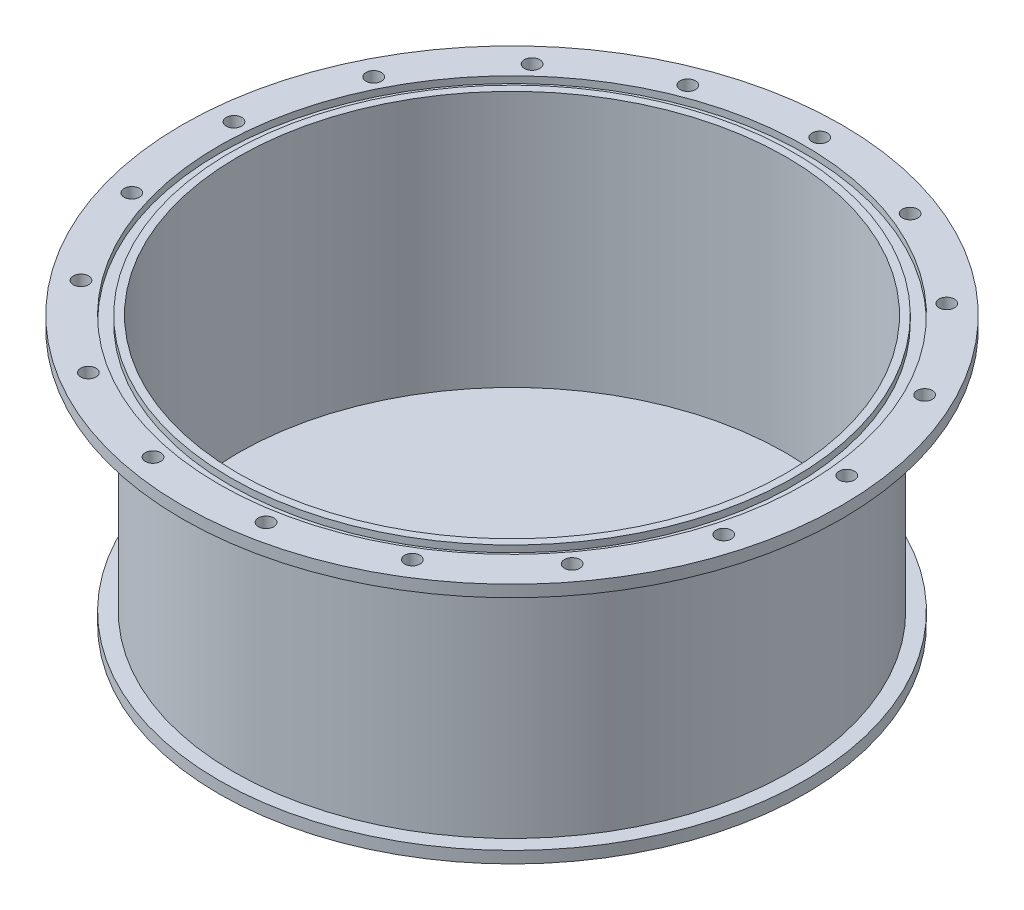
ISO-10303-21;
HEADER;
FILE_DESCRIPTION(('STEP AP214'),'2;1');
FILE_NAME('part.step','',(''),(''),'','','');
FILE_SCHEMA(('AUTOMOTIVE_DESIGN { 1 0 10303 214 1 1 1 1 }'));
ENDSEC;
DATA;
#1=APPLICATION_CONTEXT('core data for automotive mechanical design processes');
#2=APPLICATION_PROTOCOL_DEFINITION('international standard','automotive_design',2000,#1);
#3=PRODUCT_CONTEXT('',#1,'mechanical');
#4=PRODUCT('Part','Part','',(#3));
#5=PRODUCT_RELATED_PRODUCT_CATEGORY('part','',(#4));
#6=PRODUCT_DEFINITION_FORMATION('','',#4);
#7=PRODUCT_DEFINITION_CONTEXT('part definition',#1,'design');
#8=PRODUCT_DEFINITION('design','',#6,#7);
#9=PRODUCT_DEFINITION_SHAPE('','',#8);
#10=(LENGTH_UNIT() NAMED_UNIT(*) SI_UNIT(.MILLI.,.METRE.));
#11=(NAMED_UNIT(*) PLANE_ANGLE_UNIT() SI_UNIT($,.RADIAN.));
#12=(NAMED_UNIT(*) SI_UNIT($,.STERADIAN.) SOLID_ANGLE_UNIT());
#13=UNCERTAINTY_MEASURE_WITH_UNIT(LENGTH_MEASURE(1.E-05),#10,'distance_accuracy_value','');
#14=(GEOMETRIC_REPRESENTATION_CONTEXT(3) GLOBAL_UNCERTAINTY_ASSIGNED_CONTEXT((#13)) GLOBAL_UNIT_ASSIGNED_CONTEXT((#10,
#11,#12)) REPRESENTATION_CONTEXT('',''));
#15=CARTESIAN_POINT('',(0.,0.,0.));
#16=DIRECTION('',(0.,0.,1.));
#17=DIRECTION('',(1.,0.,0.));
#18=AXIS2_PLACEMENT_3D('',#15,#16,#17);
#19=CARTESIAN_POINT('',(0.,175.,0.));
#20=DIRECTION('',(0.,-1.,0.));
#21=DIRECTION('',(0.,0.,-1.));
#22=AXIS2_PLACEMENT_3D('',#19,#20,#21);
#23=CYLINDRICAL_SURFACE('',#22,190.);
#24=CARTESIAN_POINT('',(0.,0.,0.));
#25=DIRECTION('',(0.,1.,0.));
#26=DIRECTION('',(0.,0.,1.));
#27=AXIS2_PLACEMENT_3D('',#24,#25,#26);
#28=CIRCLE('',#27,190.);
#29=CARTESIAN_POINT('',(0.,0.,190.));
#30=VERTEX_POINT('',#29);
#31=EDGE_CURVE('E42',#30,#30,#28,.T.);
#32=ORIENTED_EDGE('',*,*,#31,.T.);
#33=EDGE_LOOP('',(#32));
#34=FACE_BOUND('',#33,.T.);
#35=CARTESIAN_POINT('',(0.,167.,0.));
#36=DIRECTION('',(0.,1.,0.));
#37=DIRECTION('',(0.,0.,1.));
#38=AXIS2_PLACEMENT_3D('',#35,#36,#37);
#39=CIRCLE('',#38,190.);
#40=CARTESIAN_POINT('',(0.,167.,190.));
#41=VERTEX_POINT('',#40);
#42=EDGE_CURVE('E10',#41,#41,#39,.T.);
#43=ORIENTED_EDGE('',*,*,#42,.F.);
#44=EDGE_LOOP('',(#43));
#45=FACE_BOUND('',#44,.T.);
#46=ADVANCED_FACE('F40',(#34,#45),#23,.T.);
#47=CARTESIAN_POINT('',(0.,-8.,0.));
#48=DIRECTION('',(0.,1.,0.));
#49=DIRECTION('',(0.,0.,1.));
#50=AXIS2_PLACEMENT_3D('',#47,#48,#49);
#51=CYLINDRICAL_SURFACE('',#50,200.);
#52=CARTESIAN_POINT('',(0.,-8.,0.));
#53=DIRECTION('',(0.,1.,0.));
#54=DIRECTION('',(0.,0.,1.));
#55=AXIS2_PLACEMENT_3D('',#52,#53,#54);
#56=CIRCLE('',#55,200.);
#57=CARTESIAN_POINT('',(0.,-8.,200.));
#58=VERTEX_POINT('',#57);
#59=EDGE_CURVE('E48',#58,#58,#56,.T.);
#60=ORIENTED_EDGE('',*,*,#59,.T.);
#61=EDGE_LOOP('',(#60));
#62=FACE_BOUND('',#61,.T.);
#63=CARTESIAN_POINT('',(0.,0.,0.));
#64=DIRECTION('',(0.,1.,0.));
#65=DIRECTION('',(0.,0.,1.));
#66=AXIS2_PLACEMENT_3D('',#63,#64,#65);
#67=CIRCLE('',#66,200.);
#68=CARTESIAN_POINT('',(0.,0.,200.));
#69=VERTEX_POINT('',#68);
#70=EDGE_CURVE('E52',#69,#69,#67,.T.);
#71=ORIENTED_EDGE('',*,*,#70,.F.);
#72=EDGE_LOOP('',(#71));
#73=FACE_BOUND('',#72,.T.);
#74=ADVANCED_FACE('F39',(#62,#73),#51,.T.);
#75=CARTESIAN_POINT('',(0.,-8.,0.));
#76=DIRECTION('',(0.,1.,0.));
#77=DIRECTION('',(0.,0.,1.));
#78=AXIS2_PLACEMENT_3D('',#75,#76,#77);
#79=PLANE('',#78);
#80=ORIENTED_EDGE('',*,*,#59,.F.);
#81=EDGE_LOOP('',(#80));
#82=FACE_BOUND('',#81,.T.);
#83=ADVANCED_FACE('F218',(#82),#79,.F.);
#84=CARTESIAN_POINT('',(0.,0.,0.));
#85=DIRECTION('',(0.,1.,0.));
#86=DIRECTION('',(0.,0.,1.));
#87=AXIS2_PLACEMENT_3D('',#84,#85,#86);
#88=PLANE('',#87);
#89=ORIENTED_EDGE('',*,*,#31,.F.);
#90=EDGE_LOOP('',(#89));
#91=FACE_BOUND('',#90,.T.);
#92=ORIENTED_EDGE('',*,*,#70,.T.);
#93=EDGE_LOOP('',(#92));
#94=FACE_BOUND('',#93,.T.);
#95=ADVANCED_FACE('F207',(#91,#94),#88,.T.);
#96=CARTESIAN_POINT('',(0.,167.,0.));
#97=DIRECTION('',(0.,1.,0.));
#98=DIRECTION('',(0.,0.,1.));
#99=AXIS2_PLACEMENT_3D('',#96,#97,#98);
#100=CYLINDRICAL_SURFACE('',#99,225.);
#101=CARTESIAN_POINT('',(0.,167.,0.));
#102=DIRECTION('',(0.,1.,0.));
#103=DIRECTION('',(0.,0.,1.));
#104=AXIS2_PLACEMENT_3D('',#101,#102,#103);
#105=CIRCLE('',#104,225.);
#106=CARTESIAN_POINT('',(0.,167.,225.));
#107=VERTEX_POINT('',#106);
#108=EDGE_CURVE('E56',#107,#107,#105,.T.);
#109=ORIENTED_EDGE('',*,*,#108,.T.);
#110=EDGE_LOOP('',(#109));
#111=FACE_BOUND('',#110,.T.);
#112=CARTESIAN_POINT('',(0.,175.,0.));
#113=DIRECTION('',(0.,1.,0.));
#114=DIRECTION('',(0.,0.,1.));
#115=AXIS2_PLACEMENT_3D('',#112,#113,#114);
#116=CIRCLE('',#115,225.);
#117=CARTESIAN_POINT('',(0.,175.,225.));
#118=VERTEX_POINT('',#117);
#119=EDGE_CURVE('E57',#118,#118,#116,.T.);
#120=ORIENTED_EDGE('',*,*,#119,.F.);
#121=EDGE_LOOP('',(#120));
#122=FACE_BOUND('',#121,.T.);
#123=ADVANCED_FACE('F210',(#111,#122),#100,.T.);
#124=CARTESIAN_POINT('',(0.,167.,0.));
#125=DIRECTION('',(0.,1.,0.));
#126=DIRECTION('',(0.,0.,1.));
#127=AXIS2_PLACEMENT_3D('',#124,#125,#126);
#128=PLANE('',#127);
#129=CARTESIAN_POINT('',(75.8607498992995,167.,-195.819168174916));
#130=DIRECTION('',(0.,1.,0.));
#131=DIRECTION('',(0.,0.,1.));
#132=AXIS2_PLACEMENT_3D('',#129,#130,#131);
#133=CIRCLE('',#132,5.25);
#134=CARTESIAN_POINT('',(75.8607498992995,167.,-190.569168174916));
#135=VERTEX_POINT('',#134);
#136=EDGE_CURVE('E93',#135,#135,#133,.T.);
#137=ORIENTED_EDGE('',*,*,#136,.T.);
#138=EDGE_LOOP('',(#137));
#139=FACE_BOUND('',#138,.T.);
#140=CARTESIAN_POINT('',(141.476085165775,167.,-155.19187261634));
#141=DIRECTION('',(0.,1.,0.));
#142=DIRECTION('',(0.,0.,1.));
#143=AXIS2_PLACEMENT_3D('',#140,#141,#142);
#144=CIRCLE('',#143,5.25);
#145=CARTESIAN_POINT('',(141.476085165775,167.,-149.94187261634));
#146=VERTEX_POINT('',#145);
#147=EDGE_CURVE('E94',#146,#146,#144,.T.);
#148=ORIENTED_EDGE('',*,*,#147,.T.);
#149=EDGE_LOOP('',(#148));
#150=FACE_BOUND('',#149,.T.);
#151=CARTESIAN_POINT('',(187.984291184562,167.,-93.6050547130753));
#152=DIRECTION('',(0.,1.,0.));
#153=DIRECTION('',(0.,0.,1.));
#154=AXIS2_PLACEMENT_3D('',#151,#152,#153);
#155=CIRCLE('',#154,5.25);
#156=CARTESIAN_POINT('',(187.984291184562,167.,-88.3550547130752));
#157=VERTEX_POINT('',#156);
#158=EDGE_CURVE('E100',#157,#157,#155,.T.);
#159=ORIENTED_EDGE('',*,*,#158,.T.);
#160=EDGE_LOOP('',(#159));
#161=FACE_BOUND('',#160,.T.);
#162=CARTESIAN_POINT('',(209.104177021957,167.,-19.3763554872957));
#163=DIRECTION('',(0.,1.,0.));
#164=DIRECTION('',(0.,0.,1.));
#165=AXIS2_PLACEMENT_3D('',#162,#163,#164);
#166=CIRCLE('',#165,5.25);
#167=CARTESIAN_POINT('',(209.104177021957,167.,-14.1263554872957));
#168=VERTEX_POINT('',#167);
#169=EDGE_CURVE('E99',#168,#168,#166,.T.);
#170=ORIENTED_EDGE('',*,*,#169,.T.);
#171=EDGE_LOOP('',(#170));
#172=FACE_BOUND('',#171,.T.);
#173=CARTESIAN_POINT('',(201.983385066293,167.,57.4692279151353));
#174=DIRECTION('',(0.,1.,0.));
#175=DIRECTION('',(0.,0.,1.));
#176=AXIS2_PLACEMENT_3D('',#173,#174,#175);
#177=CIRCLE('',#176,5.25);
#178=CARTESIAN_POINT('',(201.983385066293,167.,62.7192279151353));
#179=VERTEX_POINT('',#178);
#180=EDGE_CURVE('E103',#179,#179,#177,.T.);
#181=ORIENTED_EDGE('',*,*,#180,.T.);
#182=EDGE_LOOP('',(#181));
#183=FACE_BOUND('',#182,.T.);
#184=CARTESIAN_POINT('',(167.583617728851,167.,126.553273639642));
#185=DIRECTION('',(0.,1.,0.));
#186=DIRECTION('',(0.,0.,1.));
#187=AXIS2_PLACEMENT_3D('',#184,#185,#186);
#188=CIRCLE('',#187,5.25);
#189=CARTESIAN_POINT('',(167.583617728851,167.,131.803273639642));
#190=VERTEX_POINT('',#189);
#191=EDGE_CURVE('E106',#190,#190,#188,.T.);
#192=ORIENTED_EDGE('',*,*,#191,.T.);
#193=EDGE_LOOP('',(#192));
#194=FACE_BOUND('',#193,.T.);
#195=CARTESIAN_POINT('',(110.550754204246,167.,178.545598503218));
#196=DIRECTION('',(0.,1.,0.));
#197=DIRECTION('',(0.,0.,1.));
#198=AXIS2_PLACEMENT_3D('',#195,#196,#197);
#199=CIRCLE('',#198,5.25);
#200=CARTESIAN_POINT('',(110.550754204246,167.,183.795598503218));
#201=VERTEX_POINT('',#200);
#202=EDGE_CURVE('E108',#201,#201,#199,.T.);
#203=ORIENTED_EDGE('',*,*,#202,.T.);
#204=EDGE_LOOP('',(#203));
#205=FACE_BOUND('',#204,.T.);
#206=CARTESIAN_POINT('',(38.5873987414813,167.,206.424350933619));
#207=DIRECTION('',(0.,1.,0.));
#208=DIRECTION('',(0.,0.,1.));
#209=AXIS2_PLACEMENT_3D('',#206,#207,#208);
#210=CIRCLE('',#209,5.25);
#211=CARTESIAN_POINT('',(38.5873987414813,167.,211.674350933619));
#212=VERTEX_POINT('',#211);
#213=EDGE_CURVE('E115',#212,#212,#210,.T.);
#214=ORIENTED_EDGE('',*,*,#213,.T.);
#215=EDGE_LOOP('',(#214));
#216=FACE_BOUND('',#215,.T.);
#217=CARTESIAN_POINT('',(-38.5873987414784,167.,206.42435093362));
#218=DIRECTION('',(0.,1.,0.));
#219=DIRECTION('',(0.,0.,1.));
#220=AXIS2_PLACEMENT_3D('',#217,#218,#219);
#221=CIRCLE('',#220,5.25);
#222=CARTESIAN_POINT('',(-38.5873987414784,167.,211.67435093362));
#223=VERTEX_POINT('',#222);
#224=EDGE_CURVE('E113',#223,#223,#221,.T.);
#225=ORIENTED_EDGE('',*,*,#224,.T.);
#226=EDGE_LOOP('',(#225));
#227=FACE_BOUND('',#226,.T.);
#228=CARTESIAN_POINT('',(-110.550754204244,167.,178.54559850322));
#229=DIRECTION('',(0.,1.,0.));
#230=DIRECTION('',(0.,0.,1.));
#231=AXIS2_PLACEMENT_3D('',#228,#229,#230);
#232=CIRCLE('',#231,5.25);
#233=CARTESIAN_POINT('',(-110.550754204244,167.,183.79559850322));
#234=VERTEX_POINT('',#233);
#235=EDGE_CURVE('E120',#234,#234,#232,.T.);
#236=ORIENTED_EDGE('',*,*,#235,.T.);
#237=EDGE_LOOP('',(#236));
#238=FACE_BOUND('',#237,.T.);
#239=CARTESIAN_POINT('',(-167.58361772885,167.,126.553273639645));
#240=DIRECTION('',(0.,1.,0.));
#241=DIRECTION('',(0.,0.,1.));
#242=AXIS2_PLACEMENT_3D('',#239,#240,#241);
#243=CIRCLE('',#242,5.25);
#244=CARTESIAN_POINT('',(-167.58361772885,167.,131.803273639645));
#245=VERTEX_POINT('',#244);
#246=EDGE_CURVE('E122',#245,#245,#243,.T.);
#247=ORIENTED_EDGE('',*,*,#246,.T.);
#248=EDGE_LOOP('',(#247));
#249=FACE_BOUND('',#248,.T.);
#250=CARTESIAN_POINT('',(-201.983385066292,167.,57.4692279151382));
#251=DIRECTION('',(0.,1.,0.));
#252=DIRECTION('',(0.,0.,1.));
#253=AXIS2_PLACEMENT_3D('',#250,#251,#252);
#254=CIRCLE('',#253,5.25);
#255=CARTESIAN_POINT('',(-201.983385066292,167.,62.7192279151382));
#256=VERTEX_POINT('',#255);
#257=EDGE_CURVE('E124',#256,#256,#254,.T.);
#258=ORIENTED_EDGE('',*,*,#257,.T.);
#259=EDGE_LOOP('',(#258));
#260=FACE_BOUND('',#259,.T.);
#261=CARTESIAN_POINT('',(-209.104177021957,167.,-19.3763554872927));
#262=DIRECTION('',(0.,1.,0.));
#263=DIRECTION('',(0.,0.,1.));
#264=AXIS2_PLACEMENT_3D('',#261,#262,#263);
#265=CIRCLE('',#264,5.25);
#266=CARTESIAN_POINT('',(-209.104177021957,167.,-14.1263554872927));
#267=VERTEX_POINT('',#266);
#268=EDGE_CURVE('E130',#267,#267,#265,.T.);
#269=ORIENTED_EDGE('',*,*,#268,.T.);
#270=EDGE_LOOP('',(#269));
#271=FACE_BOUND('',#270,.T.);
#272=CARTESIAN_POINT('',(-187.984291184563,167.,-93.6050547130725));
#273=DIRECTION('',(0.,1.,0.));
#274=DIRECTION('',(0.,0.,1.));
#275=AXIS2_PLACEMENT_3D('',#272,#273,#274);
#276=CIRCLE('',#275,5.25);
#277=CARTESIAN_POINT('',(-187.984291184563,167.,-88.3550547130725));
#278=VERTEX_POINT('',#277);
#279=EDGE_CURVE('E128',#278,#278,#276,.T.);
#280=ORIENTED_EDGE('',*,*,#279,.T.);
#281=EDGE_LOOP('',(#280));
#282=FACE_BOUND('',#281,.T.);
#283=CARTESIAN_POINT('',(-141.476085165777,167.,-155.191872616338));
#284=DIRECTION('',(0.,1.,0.));
#285=DIRECTION('',(0.,0.,1.));
#286=AXIS2_PLACEMENT_3D('',#283,#284,#285);
#287=CIRCLE('',#286,5.25);
#288=CARTESIAN_POINT('',(-141.476085165777,167.,-149.941872616338));
#289=VERTEX_POINT('',#288);
#290=EDGE_CURVE('E135',#289,#289,#287,.T.);
#291=ORIENTED_EDGE('',*,*,#290,.T.);
#292=EDGE_LOOP('',(#291));
#293=FACE_BOUND('',#292,.T.);
#294=CARTESIAN_POINT('',(-75.8607498993023,167.,-195.819168174915));
#295=DIRECTION('',(0.,1.,0.));
#296=DIRECTION('',(0.,0.,1.));
#297=AXIS2_PLACEMENT_3D('',#294,#295,#296);
#298=CIRCLE('',#297,5.25);
#299=CARTESIAN_POINT('',(-75.8607498993023,167.,-190.569168174915));
#300=VERTEX_POINT('',#299);
#301=EDGE_CURVE('E137',#300,#300,#298,.T.);
#302=ORIENTED_EDGE('',*,*,#301,.T.);
#303=EDGE_LOOP('',(#302));
#304=FACE_BOUND('',#303,.T.);
#305=CARTESIAN_POINT('',(0.,167.,-210.));
#306=DIRECTION('',(0.,1.,0.));
#307=DIRECTION('',(0.,0.,1.));
#308=AXIS2_PLACEMENT_3D('',#305,#306,#307);
#309=CIRCLE('',#308,5.25);
#310=CARTESIAN_POINT('',(0.,167.,-204.75));
#311=VERTEX_POINT('',#310);
#312=EDGE_CURVE('E83',#311,#311,#309,.T.);
#313=ORIENTED_EDGE('',*,*,#312,.T.);
#314=EDGE_LOOP('',(#313));
#315=FACE_BOUND('',#314,.T.);
#316=ORIENTED_EDGE('',*,*,#42,.T.);
#317=EDGE_LOOP('',(#316));
#318=FACE_BOUND('',#317,.T.);
#319=ORIENTED_EDGE('',*,*,#108,.F.);
#320=EDGE_LOOP('',(#319));
#321=FACE_BOUND('',#320,.T.);
#322=ADVANCED_FACE('F191',(#139,#150,#161,#172,#183,#194,#205,#216,#227,#238,#249,#260,#271,
#282,#293,#304,#315,#318,#321),#128,.F.);
#323=CARTESIAN_POINT('',(0.,175.,0.));
#324=DIRECTION('',(0.,1.,0.));
#325=DIRECTION('',(0.,0.,1.));
#326=AXIS2_PLACEMENT_3D('',#323,#324,#325);
#327=PLANE('',#326);
#328=CARTESIAN_POINT('',(75.8607498992995,175.,-195.819168174916));
#329=DIRECTION('',(0.,1.,0.));
#330=DIRECTION('',(-0.361241666187141,0.,0.932472229404361));
#331=AXIS2_PLACEMENT_3D('',#328,#329,#330);
#332=CIRCLE('',#331,5.25);
#333=CARTESIAN_POINT('',(73.964231151817,175.,-190.923688970543));
#334=VERTEX_POINT('',#333);
#335=EDGE_CURVE('E141',#334,#334,#332,.T.);
#336=ORIENTED_EDGE('',*,*,#335,.F.);
#337=EDGE_LOOP('',(#336));
#338=FACE_BOUND('',#337,.T.);
#339=CARTESIAN_POINT('',(141.476085165775,175.,-155.19187261634));
#340=DIRECTION('',(0.,1.,0.));
#341=DIRECTION('',(-0.673695643646548,0.,0.739008917220668));
#342=AXIS2_PLACEMENT_3D('',#339,#340,#341);
#343=CIRCLE('',#342,5.25);
#344=CARTESIAN_POINT('',(137.939183036631,175.,-151.312075800932));
#345=VERTEX_POINT('',#344);
#346=EDGE_CURVE('E148',#345,#345,#343,.T.);
#347=ORIENTED_EDGE('',*,*,#346,.F.);
#348=EDGE_LOOP('',(#347));
#349=FACE_BOUND('',#348,.T.);
#350=CARTESIAN_POINT('',(187.984291184562,175.,-93.6050547130753));
#351=DIRECTION('',(0.,1.,0.));
#352=DIRECTION('',(-0.895163291355057,0.,0.445738355776549));
#353=AXIS2_PLACEMENT_3D('',#350,#351,#352);
#354=CIRCLE('',#353,5.25);
#355=CARTESIAN_POINT('',(183.284683904948,175.,-91.2649283452484));
#356=VERTEX_POINT('',#355);
#357=EDGE_CURVE('E149',#356,#356,#354,.T.);
#358=ORIENTED_EDGE('',*,*,#357,.F.);
#359=EDGE_LOOP('',(#358));
#360=FACE_BOUND('',#359,.T.);
#361=CARTESIAN_POINT('',(209.104177021957,175.,-19.3763554872957));
#362=DIRECTION('',(0.,1.,0.));
#363=DIRECTION('',(-0.995734176295033,0.,0.092268359463313));
#364=AXIS2_PLACEMENT_3D('',#361,#362,#363);
#365=CIRCLE('',#364,5.25);
#366=CARTESIAN_POINT('',(203.876572596408,175.,-18.8919466001133));
#367=VERTEX_POINT('',#366);
#368=EDGE_CURVE('E155',#367,#367,#365,.T.);
#369=ORIENTED_EDGE('',*,*,#368,.F.);
#370=EDGE_LOOP('',(#369));
#371=FACE_BOUND('',#370,.T.);
#372=CARTESIAN_POINT('',(201.983385066293,175.,57.4692279151353));
#373=DIRECTION('',(0.,1.,0.));
#374=DIRECTION('',(-0.961825643172822,0.,-0.273662990072073));
#375=AXIS2_PLACEMENT_3D('',#372,#373,#374);
#376=CIRCLE('',#375,5.25);
#377=CARTESIAN_POINT('',(196.933800439635,175.,56.0324972172569));
#378=VERTEX_POINT('',#377);
#379=EDGE_CURVE('E154',#378,#378,#376,.T.);
#380=ORIENTED_EDGE('',*,*,#379,.F.);
#381=EDGE_LOOP('',(#380));
#382=FACE_BOUND('',#381,.T.);
#383=CARTESIAN_POINT('',(167.583617728851,175.,126.553273639642));
#384=DIRECTION('',(0.,1.,0.));
#385=DIRECTION('',(-0.798017227280245,0.,-0.602634636379249));
#386=AXIS2_PLACEMENT_3D('',#383,#384,#385);
#387=CIRCLE('',#386,5.25);
#388=CARTESIAN_POINT('',(163.39402728563,175.,123.389441798651));
#389=VERTEX_POINT('',#388);
#390=EDGE_CURVE('E158',#389,#389,#387,.T.);
#391=ORIENTED_EDGE('',*,*,#390,.F.);
#392=EDGE_LOOP('',(#391));
#393=FACE_BOUND('',#392,.T.);
#394=CARTESIAN_POINT('',(110.550754204246,175.,178.545598503218));
#395=DIRECTION('',(0.,1.,0.));
#396=DIRECTION('',(-0.526432162877363,0.,-0.85021713572961));
#397=AXIS2_PLACEMENT_3D('',#394,#395,#396);
#398=CIRCLE('',#397,5.25);
#399=CARTESIAN_POINT('',(107.78698534914,175.,174.081958540638));
#400=VERTEX_POINT('',#399);
#401=EDGE_CURVE('E161',#400,#400,#398,.T.);
#402=ORIENTED_EDGE('',*,*,#401,.F.);
#403=EDGE_LOOP('',(#402));
#404=FACE_BOUND('',#403,.T.);
#405=CARTESIAN_POINT('',(38.5873987414813,175.,206.424350933619));
#406=DIRECTION('',(0.,1.,0.));
#407=DIRECTION('',(-0.183749517816578,0.,-0.9829730996839));
#408=AXIS2_PLACEMENT_3D('',#405,#406,#407);
#409=CIRCLE('',#408,5.25);
#410=CARTESIAN_POINT('',(37.6227137729443,175.,201.263742160279));
#411=VERTEX_POINT('',#410);
#412=EDGE_CURVE('E163',#411,#411,#409,.T.);
#413=ORIENTED_EDGE('',*,*,#412,.F.);
#414=EDGE_LOOP('',(#413));
#415=FACE_BOUND('',#414,.T.);
#416=CARTESIAN_POINT('',(-38.5873987414784,175.,206.42435093362));
#417=DIRECTION('',(0.,1.,0.));
#418=DIRECTION('',(0.183749517816564,0.,-0.982973099683903));
#419=AXIS2_PLACEMENT_3D('',#416,#417,#418);
#420=CIRCLE('',#419,5.25);
#421=CARTESIAN_POINT('',(-37.6227137729414,175.,201.263742160279));
#422=VERTEX_POINT('',#421);
#423=EDGE_CURVE('E170',#422,#422,#420,.T.);
#424=ORIENTED_EDGE('',*,*,#423,.F.);
#425=EDGE_LOOP('',(#424));
#426=FACE_BOUND('',#425,.T.);
#427=CARTESIAN_POINT('',(-110.550754204244,175.,178.54559850322));
#428=DIRECTION('',(0.,1.,0.));
#429=DIRECTION('',(0.526432162877351,0.,-0.850217135729617));
#430=AXIS2_PLACEMENT_3D('',#427,#428,#429);
#431=CIRCLE('',#430,5.25);
#432=CARTESIAN_POINT('',(-107.786985349138,175.,174.081958540639));
#433=VERTEX_POINT('',#432);
#434=EDGE_CURVE('E168',#433,#433,#431,.T.);
#435=ORIENTED_EDGE('',*,*,#434,.F.);
#436=EDGE_LOOP('',(#435));
#437=FACE_BOUND('',#436,.T.);
#438=CARTESIAN_POINT('',(-167.58361772885,175.,126.553273639645));
#439=DIRECTION('',(0.,1.,0.));
#440=DIRECTION('',(0.798017227280236,0.,-0.602634636379261));
#441=AXIS2_PLACEMENT_3D('',#438,#439,#440);
#442=CIRCLE('',#441,5.25);
#443=CARTESIAN_POINT('',(-163.394027285628,175.,123.389441798654));
#444=VERTEX_POINT('',#443);
#445=EDGE_CURVE('E175',#444,#444,#442,.T.);
#446=ORIENTED_EDGE('',*,*,#445,.F.);
#447=EDGE_LOOP('',(#446));
#448=FACE_BOUND('',#447,.T.);
#449=CARTESIAN_POINT('',(-201.983385066292,175.,57.4692279151382));
#450=DIRECTION('',(0.,1.,0.));
#451=DIRECTION('',(0.961825643172818,0.,-0.273662990072087));
#452=AXIS2_PLACEMENT_3D('',#449,#450,#451);
#453=CIRCLE('',#452,5.25);
#454=CARTESIAN_POINT('',(-196.933800439634,175.,56.0324972172598));
#455=VERTEX_POINT('',#454);
#456=EDGE_CURVE('E177',#455,#455,#453,.T.);
#457=ORIENTED_EDGE('',*,*,#456,.F.);
#458=EDGE_LOOP('',(#457));
#459=FACE_BOUND('',#458,.T.);
#460=CARTESIAN_POINT('',(-209.104177021957,175.,-19.3763554872927));
#461=DIRECTION('',(0.,1.,0.));
#462=DIRECTION('',(0.995734176295035,0.,0.0922683594632987));
#463=AXIS2_PLACEMENT_3D('',#460,#461,#462);
#464=CIRCLE('',#463,5.25);
#465=CARTESIAN_POINT('',(-203.876572596408,175.,-18.8919466001104));
#466=VERTEX_POINT('',#465);
#467=EDGE_CURVE('E179',#466,#466,#464,.T.);
#468=ORIENTED_EDGE('',*,*,#467,.F.);
#469=EDGE_LOOP('',(#468));
#470=FACE_BOUND('',#469,.T.);
#471=CARTESIAN_POINT('',(-187.984291184563,175.,-93.6050547130725));
#472=DIRECTION('',(0.,1.,0.));
#473=DIRECTION('',(0.895163291355063,0.,0.445738355776536));
#474=AXIS2_PLACEMENT_3D('',#471,#472,#473);
#475=CIRCLE('',#474,5.25);
#476=CARTESIAN_POINT('',(-183.284683904949,175.,-91.2649283452457));
#477=VERTEX_POINT('',#476);
#478=EDGE_CURVE('E185',#477,#477,#475,.T.);
#479=ORIENTED_EDGE('',*,*,#478,.F.);
#480=EDGE_LOOP('',(#479));
#481=FACE_BOUND('',#480,.T.);
#482=CARTESIAN_POINT('',(-141.476085165777,175.,-155.191872616338));
#483=DIRECTION('',(0.,1.,0.));
#484=DIRECTION('',(0.673695643646558,0.,0.739008917220658));
#485=AXIS2_PLACEMENT_3D('',#482,#483,#484);
#486=CIRCLE('',#485,5.25);
#487=CARTESIAN_POINT('',(-137.939183036633,175.,-151.31207580093));
#488=VERTEX_POINT('',#487);
#489=EDGE_CURVE('E142',#488,#488,#486,.T.);
#490=ORIENTED_EDGE('',*,*,#489,.F.);
#491=EDGE_LOOP('',(#490));
#492=FACE_BOUND('',#491,.T.);
#493=CARTESIAN_POINT('',(-75.8607498993023,175.,-195.819168174915));
#494=DIRECTION('',(0.,1.,0.));
#495=DIRECTION('',(0.361241666187154,0.,0.932472229404355));
#496=AXIS2_PLACEMENT_3D('',#493,#494,#495);
#497=CIRCLE('',#496,5.25);
#498=CARTESIAN_POINT('',(-73.9642311518197,175.,-190.923688970542));
#499=VERTEX_POINT('',#498);
#500=EDGE_CURVE('E139',#499,#499,#497,.T.);
#501=ORIENTED_EDGE('',*,*,#500,.F.);
#502=EDGE_LOOP('',(#501));
#503=FACE_BOUND('',#502,.T.);
#504=CARTESIAN_POINT('',(0.,175.,-210.));
#505=DIRECTION('',(0.,1.,0.));
#506=DIRECTION('',(0.,0.,1.));
#507=AXIS2_PLACEMENT_3D('',#504,#505,#506);
#508=CIRCLE('',#507,5.25);
#509=CARTESIAN_POINT('',(0.,175.,-204.75));
#510=VERTEX_POINT('',#509);
#511=EDGE_CURVE('E86',#510,#510,#508,.T.);
#512=ORIENTED_EDGE('',*,*,#511,.F.);
#513=EDGE_LOOP('',(#512));
#514=FACE_BOUND('',#513,.T.);
#515=CARTESIAN_POINT('',(0.,175.,0.));
#516=DIRECTION('',(0.,1.,0.));
#517=DIRECTION('',(0.,0.,1.));
#518=AXIS2_PLACEMENT_3D('',#515,#516,#517);
#519=CIRCLE('',#518,200.);
#520=CARTESIAN_POINT('',(0.,175.,200.));
#521=VERTEX_POINT('',#520);
#522=EDGE_CURVE('E74',#521,#521,#519,.T.);
#523=ORIENTED_EDGE('',*,*,#522,.F.);
#524=EDGE_LOOP('',(#523));
#525=FACE_BOUND('',#524,.T.);
#526=ORIENTED_EDGE('',*,*,#119,.T.);
#527=EDGE_LOOP('',(#526));
#528=FACE_BOUND('',#527,.T.);
#529=ADVANCED_FACE('F192',(#338,#349,#360,#371,#382,#393,#404,#415,#426,#437,#448,#459,#470,
#481,#492,#503,#514,#525,#528),#327,.T.);
#530=CARTESIAN_POINT('',(0.,170.4,0.));
#531=DIRECTION('',(0.,1.,0.));
#532=DIRECTION('',(0.,0.,1.));
#533=AXIS2_PLACEMENT_3D('',#530,#531,#532);
#534=CYLINDRICAL_SURFACE('',#533,200.);
#535=CARTESIAN_POINT('',(0.,170.4,0.));
#536=DIRECTION('',(0.,1.,0.));
#537=DIRECTION('',(0.,0.,1.));
#538=AXIS2_PLACEMENT_3D('',#535,#536,#537);
#539=CIRCLE('',#538,200.);
#540=CARTESIAN_POINT('',(0.,170.4,200.));
#541=VERTEX_POINT('',#540);
#542=EDGE_CURVE('E72',#541,#541,#539,.T.);
#543=ORIENTED_EDGE('',*,*,#542,.F.);
#544=EDGE_LOOP('',(#543));
#545=FACE_BOUND('',#544,.T.);
#546=ORIENTED_EDGE('',*,*,#522,.T.);
#547=EDGE_LOOP('',(#546));
#548=FACE_BOUND('',#547,.T.);
#549=ADVANCED_FACE('F194',(#545,#548),#534,.F.);
#550=CARTESIAN_POINT('',(0.,170.4,0.));
#551=DIRECTION('',(0.,1.,0.));
#552=DIRECTION('',(0.,0.,1.));
#553=AXIS2_PLACEMENT_3D('',#550,#551,#552);
#554=PLANE('',#553);
#555=CARTESIAN_POINT('',(0.,170.4,0.));
#556=DIRECTION('',(0.,1.,0.));
#557=DIRECTION('',(0.,0.,1.));
#558=AXIS2_PLACEMENT_3D('',#555,#556,#557);
#559=CIRCLE('',#558,192.2);
#560=CARTESIAN_POINT('',(0.,170.4,192.2));
#561=VERTEX_POINT('',#560);
#562=EDGE_CURVE('E76',#561,#561,#559,.T.);
#563=ORIENTED_EDGE('',*,*,#562,.F.);
#564=EDGE_LOOP('',(#563));
#565=FACE_BOUND('',#564,.T.);
#566=ORIENTED_EDGE('',*,*,#542,.T.);
#567=EDGE_LOOP('',(#566));
#568=FACE_BOUND('',#567,.T.);
#569=ADVANCED_FACE('F449',(#565,#568),#554,.T.);
#570=CARTESIAN_POINT('',(0.,170.4,0.));
#571=DIRECTION('',(0.,1.,0.));
#572=DIRECTION('',(0.,0.,1.));
#573=AXIS2_PLACEMENT_3D('',#570,#571,#572);
#574=CYLINDRICAL_SURFACE('',#573,192.2);
#575=ORIENTED_EDGE('',*,*,#562,.T.);
#576=EDGE_LOOP('',(#575));
#577=FACE_BOUND('',#576,.T.);
#578=CARTESIAN_POINT('',(0.,175.,0.));
#579=DIRECTION('',(0.,1.,0.));
#580=DIRECTION('',(0.,0.,1.));
#581=AXIS2_PLACEMENT_3D('',#578,#579,#580);
#582=CIRCLE('',#581,192.2);
#583=CARTESIAN_POINT('',(0.,175.,192.2));
#584=VERTEX_POINT('',#583);
#585=EDGE_CURVE('E77',#584,#584,#582,.T.);
#586=ORIENTED_EDGE('',*,*,#585,.F.);
#587=EDGE_LOOP('',(#586));
#588=FACE_BOUND('',#587,.T.);
#589=ADVANCED_FACE('F442',(#577,#588),#574,.T.);
#590=CARTESIAN_POINT('',(0.,0.,0.));
#591=DIRECTION('',(0.,1.,0.));
#592=DIRECTION('',(0.,0.,1.));
#593=AXIS2_PLACEMENT_3D('',#590,#591,#592);
#594=PLANE('',#593);
#595=CARTESIAN_POINT('',(0.,0.,0.));
#596=DIRECTION('',(0.,1.,0.));
#597=DIRECTION('',(0.,0.,1.));
#598=AXIS2_PLACEMENT_3D('',#595,#596,#597);
#599=CIRCLE('',#598,187.);
#600=CARTESIAN_POINT('',(0.,0.,187.));
#601=VERTEX_POINT('',#600);
#602=EDGE_CURVE('E67',#601,#601,#599,.T.);
#603=ORIENTED_EDGE('',*,*,#602,.T.);
#604=EDGE_LOOP('',(#603));
#605=FACE_BOUND('',#604,.T.);
#606=ADVANCED_FACE('F443',(#605),#594,.T.);
#607=CARTESIAN_POINT('',(0.,0.,0.));
#608=DIRECTION('',(0.,1.,0.));
#609=DIRECTION('',(0.,0.,1.));
#610=AXIS2_PLACEMENT_3D('',#607,#608,#609);
#611=CYLINDRICAL_SURFACE('',#610,187.);
#612=ORIENTED_EDGE('',*,*,#602,.F.);
#613=EDGE_LOOP('',(#612));
#614=FACE_BOUND('',#613,.T.);
#615=CARTESIAN_POINT('',(0.,175.,0.));
#616=DIRECTION('',(0.,1.,0.));
#617=DIRECTION('',(0.,0.,1.));
#618=AXIS2_PLACEMENT_3D('',#615,#616,#617);
#619=CIRCLE('',#618,187.);
#620=CARTESIAN_POINT('',(0.,175.,187.));
#621=VERTEX_POINT('',#620);
#622=EDGE_CURVE('E68',#621,#621,#619,.T.);
#623=ORIENTED_EDGE('',*,*,#622,.T.);
#624=EDGE_LOOP('',(#623));
#625=FACE_BOUND('',#624,.T.);
#626=ADVANCED_FACE('F466',(#614,#625),#611,.F.);
#627=ORIENTED_EDGE('',*,*,#622,.F.);
#628=EDGE_LOOP('',(#627));
#629=FACE_BOUND('',#628,.T.);
#630=ORIENTED_EDGE('',*,*,#585,.T.);
#631=EDGE_LOOP('',(#630));
#632=FACE_BOUND('',#631,.T.);
#633=ADVANCED_FACE('F196',(#629,#632),#327,.T.);
#634=CARTESIAN_POINT('',(0.,165.,-210.));
#635=DIRECTION('',(0.,1.,0.));
#636=DIRECTION('',(0.,0.,1.));
#637=AXIS2_PLACEMENT_3D('',#634,#635,#636);
#638=CYLINDRICAL_SURFACE('',#637,5.25);
#639=ORIENTED_EDGE('',*,*,#511,.T.);
#640=EDGE_LOOP('',(#639));
#641=FACE_BOUND('',#640,.T.);
#642=ORIENTED_EDGE('',*,*,#312,.F.);
#643=EDGE_LOOP('',(#642));
#644=FACE_BOUND('',#643,.T.);
#645=ADVANCED_FACE('F269',(#641,#644),#638,.F.);
#646=CARTESIAN_POINT('',(-75.8607498993023,165.,-195.819168174915));
#647=DIRECTION('',(0.,1.,0.));
#648=DIRECTION('',(0.,0.,1.));
#649=AXIS2_PLACEMENT_3D('',#646,#647,#648);
#650=CYLINDRICAL_SURFACE('',#649,5.25);
#651=ORIENTED_EDGE('',*,*,#500,.T.);
#652=EDGE_LOOP('',(#651));
#653=FACE_BOUND('',#652,.T.);
#654=ORIENTED_EDGE('',*,*,#301,.F.);
#655=EDGE_LOOP('',(#654));
#656=FACE_BOUND('',#655,.T.);
#657=ADVANCED_FACE('F277',(#653,#656),#650,.F.);
#658=CARTESIAN_POINT('',(-141.476085165777,165.,-155.191872616338));
#659=DIRECTION('',(0.,1.,0.));
#660=DIRECTION('',(0.,0.,1.));
#661=AXIS2_PLACEMENT_3D('',#658,#659,#660);
#662=CYLINDRICAL_SURFACE('',#661,5.25);
#663=ORIENTED_EDGE('',*,*,#489,.T.);
#664=EDGE_LOOP('',(#663));
#665=FACE_BOUND('',#664,.T.);
#666=ORIENTED_EDGE('',*,*,#290,.F.);
#667=EDGE_LOOP('',(#666));
#668=FACE_BOUND('',#667,.T.);
#669=ADVANCED_FACE('F190',(#665,#668),#662,.F.);
#670=CARTESIAN_POINT('',(-187.984291184563,165.,-93.6050547130725));
#671=DIRECTION('',(0.,1.,0.));
#672=DIRECTION('',(0.,0.,1.));
#673=AXIS2_PLACEMENT_3D('',#670,#671,#672);
#674=CYLINDRICAL_SURFACE('',#673,5.25);
#675=ORIENTED_EDGE('',*,*,#478,.T.);
#676=EDGE_LOOP('',(#675));
#677=FACE_BOUND('',#676,.T.);
#678=ORIENTED_EDGE('',*,*,#279,.F.);
#679=EDGE_LOOP('',(#678));
#680=FACE_BOUND('',#679,.T.);
#681=ADVANCED_FACE('F288',(#677,#680),#674,.F.);
#682=CARTESIAN_POINT('',(-209.104177021957,165.,-19.3763554872927));
#683=DIRECTION('',(0.,1.,0.));
#684=DIRECTION('',(0.,0.,1.));
#685=AXIS2_PLACEMENT_3D('',#682,#683,#684);
#686=CYLINDRICAL_SURFACE('',#685,5.25);
#687=ORIENTED_EDGE('',*,*,#467,.T.);
#688=EDGE_LOOP('',(#687));
#689=FACE_BOUND('',#688,.T.);
#690=ORIENTED_EDGE('',*,*,#268,.F.);
#691=EDGE_LOOP('',(#690));
#692=FACE_BOUND('',#691,.T.);
#693=ADVANCED_FACE('F299',(#689,#692),#686,.F.);
#694=CARTESIAN_POINT('',(-201.983385066292,165.,57.4692279151382));
#695=DIRECTION('',(0.,1.,0.));
#696=DIRECTION('',(0.,0.,1.));
#697=AXIS2_PLACEMENT_3D('',#694,#695,#696);
#698=CYLINDRICAL_SURFACE('',#697,5.25);
#699=ORIENTED_EDGE('',*,*,#456,.T.);
#700=EDGE_LOOP('',(#699));
#701=FACE_BOUND('',#700,.T.);
#702=ORIENTED_EDGE('',*,*,#257,.F.);
#703=EDGE_LOOP('',(#702));
#704=FACE_BOUND('',#703,.T.);
#705=ADVANCED_FACE('F301',(#701,#704),#698,.F.);
#706=CARTESIAN_POINT('',(-167.58361772885,165.,126.553273639645));
#707=DIRECTION('',(0.,1.,0.));
#708=DIRECTION('',(0.,0.,1.));
#709=AXIS2_PLACEMENT_3D('',#706,#707,#708);
#710=CYLINDRICAL_SURFACE('',#709,5.25);
#711=ORIENTED_EDGE('',*,*,#445,.T.);
#712=EDGE_LOOP('',(#711));
#713=FACE_BOUND('',#712,.T.);
#714=ORIENTED_EDGE('',*,*,#246,.F.);
#715=EDGE_LOOP('',(#714));
#716=FACE_BOUND('',#715,.T.);
#717=ADVANCED_FACE('F314',(#713,#716),#710,.F.);
#718=CARTESIAN_POINT('',(-110.550754204244,165.,178.54559850322));
#719=DIRECTION('',(0.,1.,0.));
#720=DIRECTION('',(0.,0.,1.));
#721=AXIS2_PLACEMENT_3D('',#718,#719,#720);
#722=CYLINDRICAL_SURFACE('',#721,5.25);
#723=ORIENTED_EDGE('',*,*,#434,.T.);
#724=EDGE_LOOP('',(#723));
#725=FACE_BOUND('',#724,.T.);
#726=ORIENTED_EDGE('',*,*,#235,.F.);
#727=EDGE_LOOP('',(#726));
#728=FACE_BOUND('',#727,.T.);
#729=ADVANCED_FACE('F323',(#725,#728),#722,.F.);
#730=CARTESIAN_POINT('',(-38.5873987414784,165.,206.42435093362));
#731=DIRECTION('',(0.,1.,0.));
#732=DIRECTION('',(0.,0.,1.));
#733=AXIS2_PLACEMENT_3D('',#730,#731,#732);
#734=CYLINDRICAL_SURFACE('',#733,5.25);
#735=ORIENTED_EDGE('',*,*,#423,.T.);
#736=EDGE_LOOP('',(#735));
#737=FACE_BOUND('',#736,.T.);
#738=ORIENTED_EDGE('',*,*,#224,.F.);
#739=EDGE_LOOP('',(#738));
#740=FACE_BOUND('',#739,.T.);
#741=ADVANCED_FACE('F335',(#737,#740),#734,.F.);
#742=CARTESIAN_POINT('',(38.5873987414813,165.,206.424350933619));
#743=DIRECTION('',(0.,1.,0.));
#744=DIRECTION('',(0.,0.,1.));
#745=AXIS2_PLACEMENT_3D('',#742,#743,#744);
#746=CYLINDRICAL_SURFACE('',#745,5.25);
#747=ORIENTED_EDGE('',*,*,#412,.T.);
#748=EDGE_LOOP('',(#747));
#749=FACE_BOUND('',#748,.T.);
#750=ORIENTED_EDGE('',*,*,#213,.F.);
#751=EDGE_LOOP('',(#750));
#752=FACE_BOUND('',#751,.T.);
#753=ADVANCED_FACE('F342',(#749,#752),#746,.F.);
#754=CARTESIAN_POINT('',(110.550754204246,165.,178.545598503218));
#755=DIRECTION('',(0.,1.,0.));
#756=DIRECTION('',(0.,0.,1.));
#757=AXIS2_PLACEMENT_3D('',#754,#755,#756);
#758=CYLINDRICAL_SURFACE('',#757,5.25);
#759=ORIENTED_EDGE('',*,*,#401,.T.);
#760=EDGE_LOOP('',(#759));
#761=FACE_BOUND('',#760,.T.);
#762=ORIENTED_EDGE('',*,*,#202,.F.);
#763=EDGE_LOOP('',(#762));
#764=FACE_BOUND('',#763,.T.);
#765=ADVANCED_FACE('F348',(#761,#764),#758,.F.);
#766=CARTESIAN_POINT('',(167.583617728851,165.,126.553273639642));
#767=DIRECTION('',(0.,1.,0.));
#768=DIRECTION('',(0.,0.,1.));
#769=AXIS2_PLACEMENT_3D('',#766,#767,#768);
#770=CYLINDRICAL_SURFACE('',#769,5.25);
#771=ORIENTED_EDGE('',*,*,#390,.T.);
#772=EDGE_LOOP('',(#771));
#773=FACE_BOUND('',#772,.T.);
#774=ORIENTED_EDGE('',*,*,#191,.F.);
#775=EDGE_LOOP('',(#774));
#776=FACE_BOUND('',#775,.T.);
#777=ADVANCED_FACE('F359',(#773,#776),#770,.F.);
#778=CARTESIAN_POINT('',(201.983385066293,165.,57.4692279151353));
#779=DIRECTION('',(0.,1.,0.));
#780=DIRECTION('',(0.,0.,1.));
#781=AXIS2_PLACEMENT_3D('',#778,#779,#780);
#782=CYLINDRICAL_SURFACE('',#781,5.25);
#783=ORIENTED_EDGE('',*,*,#379,.T.);
#784=EDGE_LOOP('',(#783));
#785=FACE_BOUND('',#784,.T.);
#786=ORIENTED_EDGE('',*,*,#180,.F.);
#787=EDGE_LOOP('',(#786));
#788=FACE_BOUND('',#787,.T.);
#789=ADVANCED_FACE('F366',(#785,#788),#782,.F.);
#790=CARTESIAN_POINT('',(209.104177021957,165.,-19.3763554872957));
#791=DIRECTION('',(0.,1.,0.));
#792=DIRECTION('',(0.,0.,1.));
#793=AXIS2_PLACEMENT_3D('',#790,#791,#792);
#794=CYLINDRICAL_SURFACE('',#793,5.25);
#795=ORIENTED_EDGE('',*,*,#368,.T.);
#796=EDGE_LOOP('',(#795));
#797=FACE_BOUND('',#796,.T.);
#798=ORIENTED_EDGE('',*,*,#169,.F.);
#799=EDGE_LOOP('',(#798));
#800=FACE_BOUND('',#799,.T.);
#801=ADVANCED_FACE('F380',(#797,#800),#794,.F.);
#802=CARTESIAN_POINT('',(187.984291184562,165.,-93.6050547130753));
#803=DIRECTION('',(0.,1.,0.));
#804=DIRECTION('',(0.,0.,1.));
#805=AXIS2_PLACEMENT_3D('',#802,#803,#804);
#806=CYLINDRICAL_SURFACE('',#805,5.25);
#807=ORIENTED_EDGE('',*,*,#357,.T.);
#808=EDGE_LOOP('',(#807));
#809=FACE_BOUND('',#808,.T.);
#810=ORIENTED_EDGE('',*,*,#158,.F.);
#811=EDGE_LOOP('',(#810));
#812=FACE_BOUND('',#811,.T.);
#813=ADVANCED_FACE('F387',(#809,#812),#806,.F.);
#814=CARTESIAN_POINT('',(141.476085165775,165.,-155.19187261634));
#815=DIRECTION('',(0.,1.,0.));
#816=DIRECTION('',(0.,0.,1.));
#817=AXIS2_PLACEMENT_3D('',#814,#815,#816);
#818=CYLINDRICAL_SURFACE('',#817,5.25);
#819=ORIENTED_EDGE('',*,*,#346,.T.);
#820=EDGE_LOOP('',(#819));
#821=FACE_BOUND('',#820,.T.);
#822=ORIENTED_EDGE('',*,*,#147,.F.);
#823=EDGE_LOOP('',(#822));
#824=FACE_BOUND('',#823,.T.);
#825=ADVANCED_FACE('F392',(#821,#824),#818,.F.);
#826=CARTESIAN_POINT('',(75.8607498992995,165.,-195.819168174916));
#827=DIRECTION('',(0.,1.,0.));
#828=DIRECTION('',(0.,0.,1.));
#829=AXIS2_PLACEMENT_3D('',#826,#827,#828);
#830=CYLINDRICAL_SURFACE('',#829,5.25);
#831=ORIENTED_EDGE('',*,*,#335,.T.);
#832=EDGE_LOOP('',(#831));
#833=FACE_BOUND('',#832,.T.);
#834=ORIENTED_EDGE('',*,*,#136,.F.);
#835=EDGE_LOOP('',(#834));
#836=FACE_BOUND('',#835,.T.);
#837=ADVANCED_FACE('F404',(#833,#836),#830,.F.);
#838=CLOSED_SHELL('',(#46,#74,#83,#95,#123,#322,#529,#549,#569,#589,#606,#626,#633,#645,#657,
#669,#681,#693,#705,#717,#729,#741,#753,#765,#777,#789,#801,#813,#825,#837));
#839=MANIFOLD_SOLID_BREP('B2',#838);
#840=ADVANCED_BREP_SHAPE_REPRESENTATION('',(#18,#839),#14);
#841=SHAPE_DEFINITION_REPRESENTATION(#9,#840);
ENDSEC;
END-ISO-10303-21;
